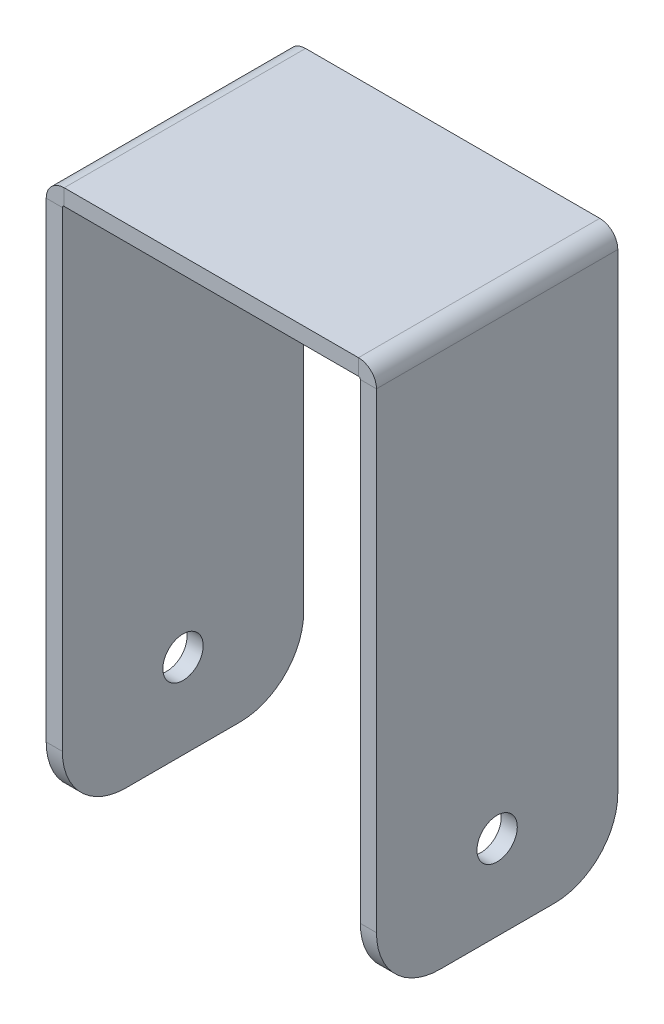
ISO-10303-21;
HEADER;
FILE_DESCRIPTION(('STEP AP214'),'2;1');
FILE_NAME('part.step','',(''),(''),'','','');
FILE_SCHEMA(('AUTOMOTIVE_DESIGN { 1 0 10303 214 1 1 1 1 }'));
ENDSEC;
DATA;
#1=APPLICATION_CONTEXT('core data for automotive mechanical design processes');
#2=APPLICATION_PROTOCOL_DEFINITION('international standard','automotive_design',2000,#1);
#3=PRODUCT_CONTEXT('',#1,'mechanical');
#4=PRODUCT('Part','Part','',(#3));
#5=PRODUCT_RELATED_PRODUCT_CATEGORY('part','',(#4));
#6=PRODUCT_DEFINITION_FORMATION('','',#4);
#7=PRODUCT_DEFINITION_CONTEXT('part definition',#1,'design');
#8=PRODUCT_DEFINITION('design','',#6,#7);
#9=PRODUCT_DEFINITION_SHAPE('','',#8);
#10=(LENGTH_UNIT() NAMED_UNIT(*) SI_UNIT(.MILLI.,.METRE.));
#11=(NAMED_UNIT(*) PLANE_ANGLE_UNIT() SI_UNIT($,.RADIAN.));
#12=(NAMED_UNIT(*) SI_UNIT($,.STERADIAN.) SOLID_ANGLE_UNIT());
#13=UNCERTAINTY_MEASURE_WITH_UNIT(LENGTH_MEASURE(1.E-05),#10,'distance_accuracy_value','');
#14=(GEOMETRIC_REPRESENTATION_CONTEXT(3) GLOBAL_UNCERTAINTY_ASSIGNED_CONTEXT((#13)) GLOBAL_UNIT_ASSIGNED_CONTEXT((#10,
#11,#12)) REPRESENTATION_CONTEXT('',''));
#15=CARTESIAN_POINT('',(0.,0.,0.));
#16=DIRECTION('',(0.,0.,1.));
#17=DIRECTION('',(1.,0.,0.));
#18=AXIS2_PLACEMENT_3D('',#15,#16,#17);
#19=CARTESIAN_POINT('',(-65.,-6.35,-47.5));
#20=DIRECTION('',(0.,0.,1.));
#21=DIRECTION('',(1.,0.,0.));
#22=AXIS2_PLACEMENT_3D('',#19,#20,#21);
#23=PLANE('',#22);
#24=DIRECTION('',(0.,1.,0.));
#25=VECTOR('',#24,1.);
#26=CARTESIAN_POINT('',(-57.9134,-6.35,-47.5));
#27=LINE('',#26,#25);
#28=CARTESIAN_POINT('',(-57.9134,-6.35,-47.5));
#29=VERTEX_POINT('',#28);
#30=CARTESIAN_POINT('',(-57.9134000000001,0.,-47.5));
#31=VERTEX_POINT('',#30);
#32=EDGE_CURVE('E284',#29,#31,#27,.T.);
#33=ORIENTED_EDGE('',*,*,#32,.T.);
#34=DIRECTION('',(1.,0.,0.));
#35=VECTOR('',#34,1.);
#36=CARTESIAN_POINT('',(-65.,0.,-47.5));
#37=LINE('',#36,#35);
#38=CARTESIAN_POINT('',(57.9134,0.,-47.5));
#39=VERTEX_POINT('',#38);
#40=EDGE_CURVE('E380',#31,#39,#37,.T.);
#41=ORIENTED_EDGE('',*,*,#40,.T.);
#42=DIRECTION('',(0.,1.,0.));
#43=VECTOR('',#42,1.);
#44=CARTESIAN_POINT('',(57.9134,-6.35,-47.5));
#45=LINE('',#44,#43);
#46=CARTESIAN_POINT('',(57.9134,-6.35,-47.5));
#47=VERTEX_POINT('',#46);
#48=EDGE_CURVE('E368',#47,#39,#45,.T.);
#49=ORIENTED_EDGE('',*,*,#48,.F.);
#50=DIRECTION('',(1.,0.,0.));
#51=VECTOR('',#50,1.);
#52=CARTESIAN_POINT('',(-65.,-6.35,-47.5));
#53=LINE('',#52,#51);
#54=EDGE_CURVE('E379',#29,#47,#53,.T.);
#55=ORIENTED_EDGE('',*,*,#54,.F.);
#56=EDGE_LOOP('',(#33,#41,#49,#55));
#57=FACE_BOUND('',#56,.T.);
#58=ADVANCED_FACE('F91',(#57),#23,.F.);
#59=CARTESIAN_POINT('',(0.,-6.35,0.));
#60=DIRECTION('',(0.,-1.,0.));
#61=DIRECTION('',(0.,0.,-1.));
#62=AXIS2_PLACEMENT_3D('',#59,#60,#61);
#63=PLANE('',#62);
#64=DIRECTION('',(1.,0.,0.));
#65=VECTOR('',#64,1.);
#66=CARTESIAN_POINT('',(-65.,-6.35,47.5));
#67=LINE('',#66,#65);
#68=CARTESIAN_POINT('',(-57.9134,-6.35,47.5));
#69=VERTEX_POINT('',#68);
#70=CARTESIAN_POINT('',(57.9134,-6.35,47.5));
#71=VERTEX_POINT('',#70);
#72=EDGE_CURVE('E376',#69,#71,#67,.T.);
#73=ORIENTED_EDGE('',*,*,#72,.F.);
#74=DIRECTION('',(0.,0.,-1.));
#75=VECTOR('',#74,1.);
#76=CARTESIAN_POINT('',(-57.9134,-6.35,-47.5));
#77=LINE('',#76,#75);
#78=EDGE_CURVE('E251',#29,#69,#77,.F.);
#79=ORIENTED_EDGE('',*,*,#78,.F.);
#80=ORIENTED_EDGE('',*,*,#54,.T.);
#81=DIRECTION('',(0.,0.,1.));
#82=VECTOR('',#81,1.);
#83=CARTESIAN_POINT('',(57.9134,-6.35,47.5));
#84=LINE('',#83,#82);
#85=EDGE_CURVE('E361',#71,#47,#84,.F.);
#86=ORIENTED_EDGE('',*,*,#85,.F.);
#87=EDGE_LOOP('',(#73,#79,#80,#86));
#88=FACE_BOUND('',#87,.T.);
#89=ADVANCED_FACE('F472',(#88),#63,.T.);
#90=CARTESIAN_POINT('',(0.,0.,0.));
#91=DIRECTION('',(0.,-1.,0.));
#92=DIRECTION('',(0.,0.,-1.));
#93=AXIS2_PLACEMENT_3D('',#90,#91,#92);
#94=PLANE('',#93);
#95=DIRECTION('',(0.,0.,-1.));
#96=VECTOR('',#95,1.);
#97=CARTESIAN_POINT('',(-57.9134000000001,0.,-47.5));
#98=LINE('',#97,#96);
#99=CARTESIAN_POINT('',(-57.9134,0.,47.5));
#100=VERTEX_POINT('',#99);
#101=EDGE_CURVE('E213',#31,#100,#98,.F.);
#102=ORIENTED_EDGE('',*,*,#101,.T.);
#103=DIRECTION('',(1.,0.,0.));
#104=VECTOR('',#103,1.);
#105=CARTESIAN_POINT('',(-65.,0.,47.5));
#106=LINE('',#105,#104);
#107=CARTESIAN_POINT('',(57.9134,0.,47.5));
#108=VERTEX_POINT('',#107);
#109=EDGE_CURVE('E372',#100,#108,#106,.T.);
#110=ORIENTED_EDGE('',*,*,#109,.T.);
#111=DIRECTION('',(0.,0.,1.));
#112=VECTOR('',#111,1.);
#113=CARTESIAN_POINT('',(57.9134,0.,47.5));
#114=LINE('',#113,#112);
#115=EDGE_CURVE('E344',#108,#39,#114,.F.);
#116=ORIENTED_EDGE('',*,*,#115,.T.);
#117=ORIENTED_EDGE('',*,*,#40,.F.);
#118=EDGE_LOOP('',(#102,#110,#116,#117));
#119=FACE_BOUND('',#118,.T.);
#120=ADVANCED_FACE('F477',(#119),#94,.F.);
#121=CARTESIAN_POINT('',(-65.,-6.35,47.5));
#122=DIRECTION('',(0.,0.,1.));
#123=DIRECTION('',(1.,0.,0.));
#124=AXIS2_PLACEMENT_3D('',#121,#122,#123);
#125=PLANE('',#124);
#126=DIRECTION('',(0.,1.,0.));
#127=VECTOR('',#126,1.);
#128=CARTESIAN_POINT('',(-57.9134,-6.35,47.5));
#129=LINE('',#128,#127);
#130=EDGE_CURVE('E292',#69,#100,#129,.T.);
#131=ORIENTED_EDGE('',*,*,#130,.F.);
#132=ORIENTED_EDGE('',*,*,#72,.T.);
#133=DIRECTION('',(0.,1.,0.));
#134=VECTOR('',#133,1.);
#135=CARTESIAN_POINT('',(57.9134,-6.35,47.5));
#136=LINE('',#135,#134);
#137=EDGE_CURVE('E353',#71,#108,#136,.T.);
#138=ORIENTED_EDGE('',*,*,#137,.T.);
#139=ORIENTED_EDGE('',*,*,#109,.F.);
#140=EDGE_LOOP('',(#131,#132,#138,#139));
#141=FACE_BOUND('',#140,.T.);
#142=ADVANCED_FACE('F475',(#141),#125,.T.);
#143=CARTESIAN_POINT('',(57.9134,-7.0866,-47.5));
#144=DIRECTION('',(0.,0.,-1.));
#145=DIRECTION('',(-1.,0.,0.));
#146=AXIS2_PLACEMENT_3D('',#143,#144,#145);
#147=PLANE('',#146);
#148=DIRECTION('',(1.,0.,0.));
#149=VECTOR('',#148,1.);
#150=CARTESIAN_POINT('',(65.,-7.08659999999997,-47.5));
#151=LINE('',#150,#149);
#152=CARTESIAN_POINT('',(58.65,-7.0866,-47.5));
#153=VERTEX_POINT('',#152);
#154=CARTESIAN_POINT('',(65.,-7.08659999999998,-47.4999999999999));
#155=VERTEX_POINT('',#154);
#156=EDGE_CURVE('E296',#153,#155,#151,.T.);
#157=ORIENTED_EDGE('',*,*,#156,.F.);
#158=CARTESIAN_POINT('',(57.9134,-7.0866,-47.5));
#159=DIRECTION('',(0.,0.,1.));
#160=DIRECTION('',(1.,0.,0.));
#161=AXIS2_PLACEMENT_3D('',#158,#159,#160);
#162=CIRCLE('',#161,0.736599999999997);
#163=EDGE_CURVE('E357',#47,#153,#162,.F.);
#164=ORIENTED_EDGE('',*,*,#163,.F.);
#165=ORIENTED_EDGE('',*,*,#48,.T.);
#166=CARTESIAN_POINT('',(57.9134,-7.0866,-47.4999999999999));
#167=DIRECTION('',(0.,0.,1.));
#168=DIRECTION('',(1.,0.,0.));
#169=AXIS2_PLACEMENT_3D('',#166,#167,#168);
#170=CIRCLE('',#169,7.0866);
#171=EDGE_CURVE('E348',#39,#155,#170,.F.);
#172=ORIENTED_EDGE('',*,*,#171,.T.);
#173=EDGE_LOOP('',(#157,#164,#165,#172));
#174=FACE_BOUND('',#173,.T.);
#175=ADVANCED_FACE('F461',(#174),#147,.T.);
#176=CARTESIAN_POINT('',(57.9134,-7.0866,47.5));
#177=DIRECTION('',(0.,0.,-1.));
#178=DIRECTION('',(-1.,0.,0.));
#179=AXIS2_PLACEMENT_3D('',#176,#177,#178);
#180=PLANE('',#179);
#181=CARTESIAN_POINT('',(57.9134,-7.0866,47.5));
#182=DIRECTION('',(0.,0.,1.));
#183=DIRECTION('',(1.,0.,0.));
#184=AXIS2_PLACEMENT_3D('',#181,#182,#183);
#185=CIRCLE('',#184,0.736599999999997);
#186=CARTESIAN_POINT('',(58.65,-7.0866,47.5));
#187=VERTEX_POINT('',#186);
#188=EDGE_CURVE('E302',#187,#71,#185,.T.);
#189=ORIENTED_EDGE('',*,*,#188,.F.);
#190=DIRECTION('',(1.,0.,0.));
#191=VECTOR('',#190,1.);
#192=CARTESIAN_POINT('',(58.65,-7.0866,47.5));
#193=LINE('',#192,#191);
#194=CARTESIAN_POINT('',(65.,-7.08659999999998,47.5));
#195=VERTEX_POINT('',#194);
#196=EDGE_CURVE('E333',#187,#195,#193,.T.);
#197=ORIENTED_EDGE('',*,*,#196,.T.);
#198=CARTESIAN_POINT('',(57.9134,-7.0866,47.5));
#199=DIRECTION('',(0.,0.,1.));
#200=DIRECTION('',(1.,0.,0.));
#201=AXIS2_PLACEMENT_3D('',#198,#199,#200);
#202=CIRCLE('',#201,7.0866);
#203=EDGE_CURVE('E349',#195,#108,#202,.T.);
#204=ORIENTED_EDGE('',*,*,#203,.T.);
#205=ORIENTED_EDGE('',*,*,#137,.F.);
#206=EDGE_LOOP('',(#189,#197,#204,#205));
#207=FACE_BOUND('',#206,.T.);
#208=ADVANCED_FACE('F454',(#207),#180,.F.);
#209=CARTESIAN_POINT('',(57.9134,-7.0866,47.5));
#210=DIRECTION('',(0.,0.,1.));
#211=DIRECTION('',(1.,0.,0.));
#212=AXIS2_PLACEMENT_3D('',#209,#210,#211);
#213=CYLINDRICAL_SURFACE('',#212,7.0866);
#214=ORIENTED_EDGE('',*,*,#115,.F.);
#215=ORIENTED_EDGE('',*,*,#203,.F.);
#216=DIRECTION('',(0.,0.,1.));
#217=VECTOR('',#216,1.);
#218=CARTESIAN_POINT('',(65.,-7.08659999999998,0.));
#219=LINE('',#218,#217);
#220=EDGE_CURVE('E329',#155,#195,#219,.T.);
#221=ORIENTED_EDGE('',*,*,#220,.F.);
#222=ORIENTED_EDGE('',*,*,#171,.F.);
#223=EDGE_LOOP('',(#214,#215,#221,#222));
#224=FACE_BOUND('',#223,.T.);
#225=ADVANCED_FACE('F459',(#224),#213,.T.);
#226=CARTESIAN_POINT('',(57.9134,-7.0866,47.5));
#227=DIRECTION('',(0.,0.,1.));
#228=DIRECTION('',(1.,0.,0.));
#229=AXIS2_PLACEMENT_3D('',#226,#227,#228);
#230=CYLINDRICAL_SURFACE('',#229,0.736599999999997);
#231=ORIENTED_EDGE('',*,*,#85,.T.);
#232=ORIENTED_EDGE('',*,*,#163,.T.);
#233=DIRECTION('',(0.,0.,-1.));
#234=VECTOR('',#233,1.);
#235=CARTESIAN_POINT('',(58.65,-7.0866,-47.5));
#236=LINE('',#235,#234);
#237=EDGE_CURVE('E337',#153,#187,#236,.F.);
#238=ORIENTED_EDGE('',*,*,#237,.T.);
#239=ORIENTED_EDGE('',*,*,#188,.T.);
#240=EDGE_LOOP('',(#231,#232,#238,#239));
#241=FACE_BOUND('',#240,.T.);
#242=ADVANCED_FACE('F469',(#241),#230,.F.);
#243=CARTESIAN_POINT('',(65.,-6.34999999999998,47.5));
#244=DIRECTION('',(0.,0.,1.));
#245=DIRECTION('',(1.,0.,0.));
#246=AXIS2_PLACEMENT_3D('',#243,#244,#245);
#247=PLANE('',#246);
#248=DIRECTION('',(0.,-1.,0.));
#249=VECTOR('',#248,1.);
#250=CARTESIAN_POINT('',(58.65,2.26435280316954E-13,47.5));
#251=LINE('',#250,#249);
#252=CARTESIAN_POINT('',(58.6500000000006,-192.4875,47.5));
#253=VERTEX_POINT('',#252);
#254=EDGE_CURVE('E310',#253,#187,#251,.F.);
#255=ORIENTED_EDGE('',*,*,#254,.F.);
#256=DIRECTION('',(-1.,0.,0.));
#257=VECTOR('',#256,1.);
#258=CARTESIAN_POINT('',(65.0000000000007,-192.4875,47.5));
#259=LINE('',#258,#257);
#260=CARTESIAN_POINT('',(65.0000000000007,-192.4875,47.5));
#261=VERTEX_POINT('',#260);
#262=EDGE_CURVE('E13',#253,#261,#259,.F.);
#263=ORIENTED_EDGE('',*,*,#262,.T.);
#264=DIRECTION('',(0.,1.,0.));
#265=VECTOR('',#264,1.);
#266=CARTESIAN_POINT('',(65.,-6.34999999999998,47.5));
#267=LINE('',#266,#265);
#268=EDGE_CURVE('E299',#261,#195,#267,.T.);
#269=ORIENTED_EDGE('',*,*,#268,.T.);
#270=ORIENTED_EDGE('',*,*,#196,.F.);
#271=EDGE_LOOP('',(#255,#263,#269,#270));
#272=FACE_BOUND('',#271,.T.);
#273=ADVANCED_FACE('F450',(#272),#247,.T.);
#274=CARTESIAN_POINT('',(65.0000000000007,-217.4875,-47.5));
#275=DIRECTION('',(0.,0.,-1.));
#276=DIRECTION('',(-1.,0.,0.));
#277=AXIS2_PLACEMENT_3D('',#274,#275,#276);
#278=PLANE('',#277);
#279=DIRECTION('',(0.,-1.,0.));
#280=VECTOR('',#279,1.);
#281=CARTESIAN_POINT('',(65.0000000000007,-217.4875,-47.5));
#282=LINE('',#281,#280);
#283=CARTESIAN_POINT('',(65.0000000000007,-192.4875,-47.5));
#284=VERTEX_POINT('',#283);
#285=EDGE_CURVE('E306',#155,#284,#282,.T.);
#286=ORIENTED_EDGE('',*,*,#285,.T.);
#287=DIRECTION('',(-1.,0.,0.));
#288=VECTOR('',#287,1.);
#289=CARTESIAN_POINT('',(65.0000000000007,-192.4875,-47.5));
#290=LINE('',#289,#288);
#291=CARTESIAN_POINT('',(58.6500000000006,-192.4875,-47.5));
#292=VERTEX_POINT('',#291);
#293=EDGE_CURVE('E412',#284,#292,#290,.T.);
#294=ORIENTED_EDGE('',*,*,#293,.T.);
#295=DIRECTION('',(0.,1.,0.));
#296=VECTOR('',#295,1.);
#297=CARTESIAN_POINT('',(58.65,2.26435280316954E-13,-47.5));
#298=LINE('',#297,#296);
#299=EDGE_CURVE('E317',#153,#292,#298,.F.);
#300=ORIENTED_EDGE('',*,*,#299,.F.);
#301=ORIENTED_EDGE('',*,*,#156,.T.);
#302=EDGE_LOOP('',(#286,#294,#300,#301));
#303=FACE_BOUND('',#302,.T.);
#304=ADVANCED_FACE('F438',(#303),#278,.T.);
#305=CARTESIAN_POINT('',(65.,2.48606186818607E-13,0.));
#306=DIRECTION('',(1.,0.,0.));
#307=DIRECTION('',(0.,1.,0.));
#308=AXIS2_PLACEMENT_3D('',#305,#306,#307);
#309=PLANE('',#308);
#310=CARTESIAN_POINT('',(65.0000000000006,-184.15,0.));
#311=DIRECTION('',(1.,0.,0.));
#312=DIRECTION('',(0.,1.,0.));
#313=AXIS2_PLACEMENT_3D('',#310,#311,#312);
#314=CIRCLE('',#313,7.93749999999999);
#315=CARTESIAN_POINT('',(65.0000000000006,-176.2125,0.));
#316=VERTEX_POINT('',#315);
#317=EDGE_CURVE('E321',#316,#316,#314,.F.);
#318=ORIENTED_EDGE('',*,*,#317,.T.);
#319=EDGE_LOOP('',(#318));
#320=FACE_BOUND('',#319,.T.);
#321=DIRECTION('',(0.,0.,1.));
#322=VECTOR('',#321,1.);
#323=CARTESIAN_POINT('',(65.0000000000007,-217.4875,47.5));
#324=LINE('',#323,#322);
#325=CARTESIAN_POINT('',(65.0000000000007,-217.4875,-22.5));
#326=VERTEX_POINT('',#325);
#327=CARTESIAN_POINT('',(65.0000000000007,-217.4875,22.5));
#328=VERTEX_POINT('',#327);
#329=EDGE_CURVE('E303',#326,#328,#324,.T.);
#330=ORIENTED_EDGE('',*,*,#329,.F.);
#331=CARTESIAN_POINT('',(65.0000000000006,-192.4875,-22.5));
#332=DIRECTION('',(1.,0.,0.));
#333=DIRECTION('',(0.,1.,0.));
#334=AXIS2_PLACEMENT_3D('',#331,#332,#333);
#335=CIRCLE('',#334,25.);
#336=EDGE_CURVE('E100',#326,#284,#335,.T.);
#337=ORIENTED_EDGE('',*,*,#336,.T.);
#338=ORIENTED_EDGE('',*,*,#285,.F.);
#339=ORIENTED_EDGE('',*,*,#220,.T.);
#340=ORIENTED_EDGE('',*,*,#268,.F.);
#341=CARTESIAN_POINT('',(65.0000000000006,-192.4875,22.5));
#342=DIRECTION('',(1.,0.,0.));
#343=DIRECTION('',(0.,1.,0.));
#344=AXIS2_PLACEMENT_3D('',#341,#342,#343);
#345=CIRCLE('',#344,25.);
#346=EDGE_CURVE('E112',#261,#328,#345,.T.);
#347=ORIENTED_EDGE('',*,*,#346,.T.);
#348=EDGE_LOOP('',(#330,#337,#338,#339,#340,#347));
#349=FACE_BOUND('',#348,.T.);
#350=ADVANCED_FACE('F433',(#320,#349),#309,.T.);
#351=CARTESIAN_POINT('',(58.65,2.26435280316954E-13,0.));
#352=DIRECTION('',(1.,0.,0.));
#353=DIRECTION('',(0.,1.,0.));
#354=AXIS2_PLACEMENT_3D('',#351,#352,#353);
#355=PLANE('',#354);
#356=CARTESIAN_POINT('',(58.6500000000006,-184.15,0.));
#357=DIRECTION('',(1.,0.,0.));
#358=DIRECTION('',(0.,1.,0.));
#359=AXIS2_PLACEMENT_3D('',#356,#357,#358);
#360=CIRCLE('',#359,7.93749999999999);
#361=CARTESIAN_POINT('',(58.6500000000006,-176.2125,0.));
#362=VERTEX_POINT('',#361);
#363=EDGE_CURVE('E325',#362,#362,#360,.F.);
#364=ORIENTED_EDGE('',*,*,#363,.F.);
#365=EDGE_LOOP('',(#364));
#366=FACE_BOUND('',#365,.T.);
#367=ORIENTED_EDGE('',*,*,#299,.T.);
#368=CARTESIAN_POINT('',(58.6500000000006,-192.4875,-22.5));
#369=DIRECTION('',(1.,0.,0.));
#370=DIRECTION('',(0.,1.,0.));
#371=AXIS2_PLACEMENT_3D('',#368,#369,#370);
#372=CIRCLE('',#371,25.);
#373=CARTESIAN_POINT('',(58.6500000000007,-217.4875,-22.5));
#374=VERTEX_POINT('',#373);
#375=EDGE_CURVE('E419',#292,#374,#372,.F.);
#376=ORIENTED_EDGE('',*,*,#375,.T.);
#377=DIRECTION('',(0.,0.,-1.));
#378=VECTOR('',#377,1.);
#379=CARTESIAN_POINT('',(58.6500000000007,-217.4875,0.));
#380=LINE('',#379,#378);
#381=CARTESIAN_POINT('',(58.6500000000007,-217.4875,22.5));
#382=VERTEX_POINT('',#381);
#383=EDGE_CURVE('E313',#374,#382,#380,.F.);
#384=ORIENTED_EDGE('',*,*,#383,.T.);
#385=CARTESIAN_POINT('',(58.6500000000006,-192.4875,22.5));
#386=DIRECTION('',(1.,0.,0.));
#387=DIRECTION('',(0.,1.,0.));
#388=AXIS2_PLACEMENT_3D('',#385,#386,#387);
#389=CIRCLE('',#388,25.);
#390=EDGE_CURVE('E416',#382,#253,#389,.F.);
#391=ORIENTED_EDGE('',*,*,#390,.T.);
#392=ORIENTED_EDGE('',*,*,#254,.T.);
#393=ORIENTED_EDGE('',*,*,#237,.F.);
#394=EDGE_LOOP('',(#367,#376,#384,#391,#392,#393));
#395=FACE_BOUND('',#394,.T.);
#396=ADVANCED_FACE('F443',(#366,#395),#355,.F.);
#397=CARTESIAN_POINT('',(65.0000000000007,-217.4875,47.5));
#398=DIRECTION('',(0.,-1.,0.));
#399=DIRECTION('',(1.,0.,0.));
#400=AXIS2_PLACEMENT_3D('',#397,#398,#399);
#401=PLANE('',#400);
#402=ORIENTED_EDGE('',*,*,#383,.F.);
#403=DIRECTION('',(-1.,0.,0.));
#404=VECTOR('',#403,1.);
#405=CARTESIAN_POINT('',(65.0000000000007,-217.4875,-22.5));
#406=LINE('',#405,#404);
#407=EDGE_CURVE('E426',#374,#326,#406,.F.);
#408=ORIENTED_EDGE('',*,*,#407,.T.);
#409=ORIENTED_EDGE('',*,*,#329,.T.);
#410=DIRECTION('',(-1.,0.,0.));
#411=VECTOR('',#410,1.);
#412=CARTESIAN_POINT('',(65.0000000000007,-217.4875,22.5));
#413=LINE('',#412,#411);
#414=EDGE_CURVE('E422',#328,#382,#413,.T.);
#415=ORIENTED_EDGE('',*,*,#414,.T.);
#416=EDGE_LOOP('',(#402,#408,#409,#415));
#417=FACE_BOUND('',#416,.T.);
#418=ADVANCED_FACE('F446',(#417),#401,.T.);
#419=CARTESIAN_POINT('',(65.0000000000006,-184.15,0.));
#420=DIRECTION('',(-1.,0.,0.));
#421=DIRECTION('',(0.,-1.,0.));
#422=AXIS2_PLACEMENT_3D('',#419,#420,#421);
#423=CYLINDRICAL_SURFACE('',#422,7.93749999999999);
#424=ORIENTED_EDGE('',*,*,#317,.F.);
#425=EDGE_LOOP('',(#424));
#426=FACE_BOUND('',#425,.T.);
#427=ORIENTED_EDGE('',*,*,#363,.T.);
#428=EDGE_LOOP('',(#427));
#429=FACE_BOUND('',#428,.T.);
#430=ADVANCED_FACE('F625',(#426,#429),#423,.F.);
#431=CARTESIAN_POINT('',(-57.9134,-7.0866,47.5));
#432=DIRECTION('',(0.,0.,1.));
#433=DIRECTION('',(1.,0.,0.));
#434=AXIS2_PLACEMENT_3D('',#431,#432,#433);
#435=PLANE('',#434);
#436=DIRECTION('',(1.,0.,0.));
#437=VECTOR('',#436,1.);
#438=CARTESIAN_POINT('',(-65.,-7.08659999999998,47.5));
#439=LINE('',#438,#437);
#440=CARTESIAN_POINT('',(-58.65,-7.0866,47.5));
#441=VERTEX_POINT('',#440);
#442=CARTESIAN_POINT('',(-65.,-7.08659999999998,47.5));
#443=VERTEX_POINT('',#442);
#444=EDGE_CURVE('E276',#441,#443,#439,.F.);
#445=ORIENTED_EDGE('',*,*,#444,.F.);
#446=CARTESIAN_POINT('',(-57.9134,-7.0866,47.5));
#447=DIRECTION('',(0.,0.,-1.));
#448=DIRECTION('',(-1.,0.,0.));
#449=AXIS2_PLACEMENT_3D('',#446,#447,#448);
#450=CIRCLE('',#449,0.736600000000004);
#451=EDGE_CURVE('E217',#69,#441,#450,.F.);
#452=ORIENTED_EDGE('',*,*,#451,.F.);
#453=ORIENTED_EDGE('',*,*,#130,.T.);
#454=CARTESIAN_POINT('',(-57.9134,-7.0866,47.5));
#455=DIRECTION('',(0.,0.,-1.));
#456=DIRECTION('',(-1.,0.,0.));
#457=AXIS2_PLACEMENT_3D('',#454,#455,#456);
#458=CIRCLE('',#457,7.0866);
#459=EDGE_CURVE('E282',#100,#443,#458,.F.);
#460=ORIENTED_EDGE('',*,*,#459,.T.);
#461=EDGE_LOOP('',(#445,#452,#453,#460));
#462=FACE_BOUND('',#461,.T.);
#463=ADVANCED_FACE('F616',(#462),#435,.T.);
#464=CARTESIAN_POINT('',(-57.9134,-7.0866,-47.5));
#465=DIRECTION('',(0.,0.,1.));
#466=DIRECTION('',(1.,0.,0.));
#467=AXIS2_PLACEMENT_3D('',#464,#465,#466);
#468=PLANE('',#467);
#469=CARTESIAN_POINT('',(-57.9134,-7.0866,-47.5));
#470=DIRECTION('',(0.,0.,-1.));
#471=DIRECTION('',(-1.,0.,0.));
#472=AXIS2_PLACEMENT_3D('',#469,#470,#471);
#473=CIRCLE('',#472,0.736600000000004);
#474=CARTESIAN_POINT('',(-58.65,-7.0866,-47.5));
#475=VERTEX_POINT('',#474);
#476=EDGE_CURVE('E224',#475,#29,#473,.T.);
#477=ORIENTED_EDGE('',*,*,#476,.F.);
#478=DIRECTION('',(1.,0.,0.));
#479=VECTOR('',#478,1.);
#480=CARTESIAN_POINT('',(-58.65,-7.0866,-47.5));
#481=LINE('',#480,#479);
#482=CARTESIAN_POINT('',(-65.,-7.08659999999998,-47.5));
#483=VERTEX_POINT('',#482);
#484=EDGE_CURVE('E221',#475,#483,#481,.F.);
#485=ORIENTED_EDGE('',*,*,#484,.T.);
#486=CARTESIAN_POINT('',(-57.9134,-7.0866,-47.5));
#487=DIRECTION('',(0.,0.,-1.));
#488=DIRECTION('',(-1.,0.,0.));
#489=AXIS2_PLACEMENT_3D('',#486,#487,#488);
#490=CIRCLE('',#489,7.0866);
#491=EDGE_CURVE('E206',#483,#31,#490,.T.);
#492=ORIENTED_EDGE('',*,*,#491,.T.);
#493=ORIENTED_EDGE('',*,*,#32,.F.);
#494=EDGE_LOOP('',(#477,#485,#492,#493));
#495=FACE_BOUND('',#494,.T.);
#496=ADVANCED_FACE('F222',(#495),#468,.F.);
#497=CARTESIAN_POINT('',(-57.9134,-7.0866,-47.5));
#498=DIRECTION('',(0.,0.,-1.));
#499=DIRECTION('',(-1.,0.,0.));
#500=AXIS2_PLACEMENT_3D('',#497,#498,#499);
#501=CYLINDRICAL_SURFACE('',#500,7.0866);
#502=ORIENTED_EDGE('',*,*,#101,.F.);
#503=ORIENTED_EDGE('',*,*,#491,.F.);
#504=DIRECTION('',(0.,0.,-1.));
#505=VECTOR('',#504,1.);
#506=CARTESIAN_POINT('',(-65.,-7.08659999999998,0.));
#507=LINE('',#506,#505);
#508=EDGE_CURVE('E211',#443,#483,#507,.T.);
#509=ORIENTED_EDGE('',*,*,#508,.F.);
#510=ORIENTED_EDGE('',*,*,#459,.F.);
#511=EDGE_LOOP('',(#502,#503,#509,#510));
#512=FACE_BOUND('',#511,.T.);
#513=ADVANCED_FACE('F208',(#512),#501,.T.);
#514=CARTESIAN_POINT('',(-57.9134,-7.0866,-47.5));
#515=DIRECTION('',(0.,0.,-1.));
#516=DIRECTION('',(-1.,0.,0.));
#517=AXIS2_PLACEMENT_3D('',#514,#515,#516);
#518=CYLINDRICAL_SURFACE('',#517,0.736600000000004);
#519=ORIENTED_EDGE('',*,*,#78,.T.);
#520=ORIENTED_EDGE('',*,*,#451,.T.);
#521=DIRECTION('',(0.,0.,1.));
#522=VECTOR('',#521,1.);
#523=CARTESIAN_POINT('',(-58.65,-7.0866,47.5));
#524=LINE('',#523,#522);
#525=EDGE_CURVE('E230',#441,#475,#524,.F.);
#526=ORIENTED_EDGE('',*,*,#525,.T.);
#527=ORIENTED_EDGE('',*,*,#476,.T.);
#528=EDGE_LOOP('',(#519,#520,#526,#527));
#529=FACE_BOUND('',#528,.T.);
#530=ADVANCED_FACE('F586',(#529),#518,.F.);
#531=CARTESIAN_POINT('',(-65.,2.48606186818607E-13,0.));
#532=DIRECTION('',(-1.,0.,0.));
#533=DIRECTION('',(0.,1.,0.));
#534=AXIS2_PLACEMENT_3D('',#531,#532,#533);
#535=PLANE('',#534);
#536=CARTESIAN_POINT('',(-65.0000000000006,-184.15,0.));
#537=DIRECTION('',(-1.,0.,0.));
#538=DIRECTION('',(0.,-1.,0.));
#539=AXIS2_PLACEMENT_3D('',#536,#537,#538);
#540=CIRCLE('',#539,7.93749999999999);
#541=CARTESIAN_POINT('',(-65.0000000000006,-192.0875,0.));
#542=VERTEX_POINT('',#541);
#543=EDGE_CURVE('E267',#542,#542,#540,.T.);
#544=ORIENTED_EDGE('',*,*,#543,.F.);
#545=EDGE_LOOP('',(#544));
#546=FACE_BOUND('',#545,.T.);
#547=DIRECTION('',(0.,0.,-1.));
#548=VECTOR('',#547,1.);
#549=CARTESIAN_POINT('',(-65.0000000000007,-217.4875,0.));
#550=LINE('',#549,#548);
#551=CARTESIAN_POINT('',(-65.0000000000007,-217.4875,-22.5));
#552=VERTEX_POINT('',#551);
#553=CARTESIAN_POINT('',(-65.0000000000007,-217.4875,22.5));
#554=VERTEX_POINT('',#553);
#555=EDGE_CURVE('E247',#552,#554,#550,.F.);
#556=ORIENTED_EDGE('',*,*,#555,.T.);
#557=CARTESIAN_POINT('',(-65.0000000000006,-192.4875,22.5));
#558=DIRECTION('',(-1.,0.,0.));
#559=DIRECTION('',(0.,-1.,0.));
#560=AXIS2_PLACEMENT_3D('',#557,#558,#559);
#561=CIRCLE('',#560,25.);
#562=CARTESIAN_POINT('',(-65.0000000000006,-192.4875,47.5));
#563=VERTEX_POINT('',#562);
#564=EDGE_CURVE('E407',#554,#563,#561,.T.);
#565=ORIENTED_EDGE('',*,*,#564,.T.);
#566=DIRECTION('',(0.,-1.,0.));
#567=VECTOR('',#566,1.);
#568=CARTESIAN_POINT('',(-65.,2.48606186818607E-13,47.5));
#569=LINE('',#568,#567);
#570=EDGE_CURVE('E239',#563,#443,#569,.F.);
#571=ORIENTED_EDGE('',*,*,#570,.T.);
#572=ORIENTED_EDGE('',*,*,#508,.T.);
#573=DIRECTION('',(0.,1.,0.));
#574=VECTOR('',#573,1.);
#575=CARTESIAN_POINT('',(-65.,2.48606186818607E-13,-47.5));
#576=LINE('',#575,#574);
#577=CARTESIAN_POINT('',(-65.0000000000006,-192.4875,-47.5));
#578=VERTEX_POINT('',#577);
#579=EDGE_CURVE('E236',#483,#578,#576,.F.);
#580=ORIENTED_EDGE('',*,*,#579,.T.);
#581=CARTESIAN_POINT('',(-65.0000000000006,-192.4875,-22.5));
#582=DIRECTION('',(-1.,0.,0.));
#583=DIRECTION('',(0.,-1.,0.));
#584=AXIS2_PLACEMENT_3D('',#581,#582,#583);
#585=CIRCLE('',#584,25.);
#586=EDGE_CURVE('E404',#578,#552,#585,.T.);
#587=ORIENTED_EDGE('',*,*,#586,.T.);
#588=EDGE_LOOP('',(#556,#565,#571,#572,#580,#587));
#589=FACE_BOUND('',#588,.T.);
#590=ADVANCED_FACE('F235',(#546,#589),#535,.T.);
#591=CARTESIAN_POINT('',(-58.65,2.26435280316954E-13,0.));
#592=DIRECTION('',(-1.,0.,0.));
#593=DIRECTION('',(0.,1.,0.));
#594=AXIS2_PLACEMENT_3D('',#591,#592,#593);
#595=PLANE('',#594);
#596=CARTESIAN_POINT('',(-58.6500000000006,-184.15,0.));
#597=DIRECTION('',(-1.,0.,0.));
#598=DIRECTION('',(0.,-1.,0.));
#599=AXIS2_PLACEMENT_3D('',#596,#597,#598);
#600=CIRCLE('',#599,7.93749999999999);
#601=CARTESIAN_POINT('',(-58.6500000000006,-192.0875,0.));
#602=VERTEX_POINT('',#601);
#603=EDGE_CURVE('E241',#602,#602,#600,.T.);
#604=ORIENTED_EDGE('',*,*,#603,.T.);
#605=EDGE_LOOP('',(#604));
#606=FACE_BOUND('',#605,.T.);
#607=DIRECTION('',(0.,1.,0.));
#608=VECTOR('',#607,1.);
#609=CARTESIAN_POINT('',(-58.65,-6.35,47.5));
#610=LINE('',#609,#608);
#611=CARTESIAN_POINT('',(-58.6500000000006,-192.4875,47.5));
#612=VERTEX_POINT('',#611);
#613=EDGE_CURVE('E264',#612,#441,#610,.T.);
#614=ORIENTED_EDGE('',*,*,#613,.F.);
#615=CARTESIAN_POINT('',(-58.6500000000006,-192.4875,22.5));
#616=DIRECTION('',(-1.,0.,0.));
#617=DIRECTION('',(0.,-1.,0.));
#618=AXIS2_PLACEMENT_3D('',#615,#616,#617);
#619=CIRCLE('',#618,25.);
#620=CARTESIAN_POINT('',(-58.6500000000007,-217.4875,22.5));
#621=VERTEX_POINT('',#620);
#622=EDGE_CURVE('E394',#612,#621,#619,.F.);
#623=ORIENTED_EDGE('',*,*,#622,.T.);
#624=DIRECTION('',(0.,0.,1.));
#625=VECTOR('',#624,1.);
#626=CARTESIAN_POINT('',(-58.6500000000007,-217.4875,47.5));
#627=LINE('',#626,#625);
#628=CARTESIAN_POINT('',(-58.6500000000007,-217.4875,-22.5));
#629=VERTEX_POINT('',#628);
#630=EDGE_CURVE('E260',#629,#621,#627,.T.);
#631=ORIENTED_EDGE('',*,*,#630,.F.);
#632=CARTESIAN_POINT('',(-58.6500000000006,-192.4875,-22.5));
#633=DIRECTION('',(-1.,0.,0.));
#634=DIRECTION('',(0.,-1.,0.));
#635=AXIS2_PLACEMENT_3D('',#632,#633,#634);
#636=CIRCLE('',#635,25.);
#637=CARTESIAN_POINT('',(-58.6500000000006,-192.4875,-47.5));
#638=VERTEX_POINT('',#637);
#639=EDGE_CURVE('E391',#629,#638,#636,.F.);
#640=ORIENTED_EDGE('',*,*,#639,.T.);
#641=DIRECTION('',(0.,-1.,0.));
#642=VECTOR('',#641,1.);
#643=CARTESIAN_POINT('',(-58.6500000000007,-217.4875,-47.5));
#644=LINE('',#643,#642);
#645=EDGE_CURVE('E257',#475,#638,#644,.T.);
#646=ORIENTED_EDGE('',*,*,#645,.F.);
#647=ORIENTED_EDGE('',*,*,#525,.F.);
#648=EDGE_LOOP('',(#614,#623,#631,#640,#646,#647));
#649=FACE_BOUND('',#648,.T.);
#650=ADVANCED_FACE('F566',(#606,#649),#595,.F.);
#651=CARTESIAN_POINT('',(-65.0000000000007,-217.4875,-47.5));
#652=DIRECTION('',(0.,0.,1.));
#653=DIRECTION('',(1.,0.,0.));
#654=AXIS2_PLACEMENT_3D('',#651,#652,#653);
#655=PLANE('',#654);
#656=ORIENTED_EDGE('',*,*,#645,.T.);
#657=DIRECTION('',(1.,0.,0.));
#658=VECTOR('',#657,1.);
#659=CARTESIAN_POINT('',(-65.0000000000007,-192.4875,-47.5));
#660=LINE('',#659,#658);
#661=EDGE_CURVE('E245',#638,#578,#660,.F.);
#662=ORIENTED_EDGE('',*,*,#661,.T.);
#663=ORIENTED_EDGE('',*,*,#579,.F.);
#664=ORIENTED_EDGE('',*,*,#484,.F.);
#665=EDGE_LOOP('',(#656,#662,#663,#664));
#666=FACE_BOUND('',#665,.T.);
#667=ADVANCED_FACE('F243',(#666),#655,.F.);
#668=CARTESIAN_POINT('',(-65.,-6.34999999999998,47.5));
#669=DIRECTION('',(0.,0.,-1.));
#670=DIRECTION('',(-1.,0.,0.));
#671=AXIS2_PLACEMENT_3D('',#668,#669,#670);
#672=PLANE('',#671);
#673=ORIENTED_EDGE('',*,*,#570,.F.);
#674=DIRECTION('',(1.,0.,0.));
#675=VECTOR('',#674,1.);
#676=CARTESIAN_POINT('',(-65.0000000000007,-192.4875,47.5));
#677=LINE('',#676,#675);
#678=EDGE_CURVE('E383',#563,#612,#677,.T.);
#679=ORIENTED_EDGE('',*,*,#678,.T.);
#680=ORIENTED_EDGE('',*,*,#613,.T.);
#681=ORIENTED_EDGE('',*,*,#444,.T.);
#682=EDGE_LOOP('',(#673,#679,#680,#681));
#683=FACE_BOUND('',#682,.T.);
#684=ADVANCED_FACE('F545',(#683),#672,.F.);
#685=CARTESIAN_POINT('',(-65.0000000000007,-217.4875,47.5));
#686=DIRECTION('',(0.,1.,0.));
#687=DIRECTION('',(-1.,0.,0.));
#688=AXIS2_PLACEMENT_3D('',#685,#686,#687);
#689=PLANE('',#688);
#690=ORIENTED_EDGE('',*,*,#630,.T.);
#691=DIRECTION('',(1.,0.,0.));
#692=VECTOR('',#691,1.);
#693=CARTESIAN_POINT('',(-65.0000000000007,-217.4875,22.5));
#694=LINE('',#693,#692);
#695=EDGE_CURVE('E401',#621,#554,#694,.F.);
#696=ORIENTED_EDGE('',*,*,#695,.T.);
#697=ORIENTED_EDGE('',*,*,#555,.F.);
#698=DIRECTION('',(1.,0.,0.));
#699=VECTOR('',#698,1.);
#700=CARTESIAN_POINT('',(-65.0000000000007,-217.4875,-22.5));
#701=LINE('',#700,#699);
#702=EDGE_CURVE('E397',#552,#629,#701,.T.);
#703=ORIENTED_EDGE('',*,*,#702,.T.);
#704=EDGE_LOOP('',(#690,#696,#697,#703));
#705=FACE_BOUND('',#704,.T.);
#706=ADVANCED_FACE('F533',(#705),#689,.F.);
#707=CARTESIAN_POINT('',(-65.0000000000006,-184.15,0.));
#708=DIRECTION('',(1.,0.,0.));
#709=DIRECTION('',(0.,1.,0.));
#710=AXIS2_PLACEMENT_3D('',#707,#708,#709);
#711=CYLINDRICAL_SURFACE('',#710,7.93749999999999);
#712=ORIENTED_EDGE('',*,*,#543,.T.);
#713=EDGE_LOOP('',(#712));
#714=FACE_BOUND('',#713,.T.);
#715=ORIENTED_EDGE('',*,*,#603,.F.);
#716=EDGE_LOOP('',(#715));
#717=FACE_BOUND('',#716,.T.);
#718=ADVANCED_FACE('F496',(#714,#717),#711,.F.);
#719=CARTESIAN_POINT('',(-65.0000000000007,-192.4875,22.5));
#720=DIRECTION('',(1.,0.,0.));
#721=DIRECTION('',(0.,1.,0.));
#722=AXIS2_PLACEMENT_3D('',#719,#720,#721);
#723=CYLINDRICAL_SURFACE('',#722,25.);
#724=ORIENTED_EDGE('',*,*,#564,.F.);
#725=ORIENTED_EDGE('',*,*,#695,.F.);
#726=ORIENTED_EDGE('',*,*,#622,.F.);
#727=ORIENTED_EDGE('',*,*,#678,.F.);
#728=EDGE_LOOP('',(#724,#725,#726,#727));
#729=FACE_BOUND('',#728,.T.);
#730=ADVANCED_FACE('F492',(#729),#723,.T.);
#731=CARTESIAN_POINT('',(-65.0000000000007,-192.4875,-22.5));
#732=DIRECTION('',(1.,0.,0.));
#733=DIRECTION('',(0.,1.,0.));
#734=AXIS2_PLACEMENT_3D('',#731,#732,#733);
#735=CYLINDRICAL_SURFACE('',#734,25.);
#736=ORIENTED_EDGE('',*,*,#586,.F.);
#737=ORIENTED_EDGE('',*,*,#661,.F.);
#738=ORIENTED_EDGE('',*,*,#639,.F.);
#739=ORIENTED_EDGE('',*,*,#702,.F.);
#740=EDGE_LOOP('',(#736,#737,#738,#739));
#741=FACE_BOUND('',#740,.T.);
#742=ADVANCED_FACE('F495',(#741),#735,.T.);
#743=CARTESIAN_POINT('',(65.0000000000007,-192.4875,-22.5));
#744=DIRECTION('',(-1.,0.,0.));
#745=DIRECTION('',(0.,-1.,0.));
#746=AXIS2_PLACEMENT_3D('',#743,#744,#745);
#747=CYLINDRICAL_SURFACE('',#746,25.);
#748=ORIENTED_EDGE('',*,*,#336,.F.);
#749=ORIENTED_EDGE('',*,*,#407,.F.);
#750=ORIENTED_EDGE('',*,*,#375,.F.);
#751=ORIENTED_EDGE('',*,*,#293,.F.);
#752=EDGE_LOOP('',(#748,#749,#750,#751));
#753=FACE_BOUND('',#752,.T.);
#754=ADVANCED_FACE('F440',(#753),#747,.T.);
#755=CARTESIAN_POINT('',(65.0000000000007,-192.4875,22.5));
#756=DIRECTION('',(-1.,0.,0.));
#757=DIRECTION('',(0.,-1.,0.));
#758=AXIS2_PLACEMENT_3D('',#755,#756,#757);
#759=CYLINDRICAL_SURFACE('',#758,25.);
#760=ORIENTED_EDGE('',*,*,#346,.F.);
#761=ORIENTED_EDGE('',*,*,#262,.F.);
#762=ORIENTED_EDGE('',*,*,#390,.F.);
#763=ORIENTED_EDGE('',*,*,#414,.F.);
#764=EDGE_LOOP('',(#760,#761,#762,#763));
#765=FACE_BOUND('',#764,.T.);
#766=ADVANCED_FACE('F93',(#765),#759,.T.);
#767=CLOSED_SHELL('',(#58,#89,#120,#142,#175,#208,#225,#242,#273,#304,#350,#396,#418,#430,#463,
#496,#513,#530,#590,#650,#667,#684,#706,#718,#730,#742,#754,#766));
#768=MANIFOLD_SOLID_BREP('B2',#767);
#769=ADVANCED_BREP_SHAPE_REPRESENTATION('',(#18,#768),#14);
#770=SHAPE_DEFINITION_REPRESENTATION(#9,#769);
ENDSEC;
END-ISO-10303-21;
